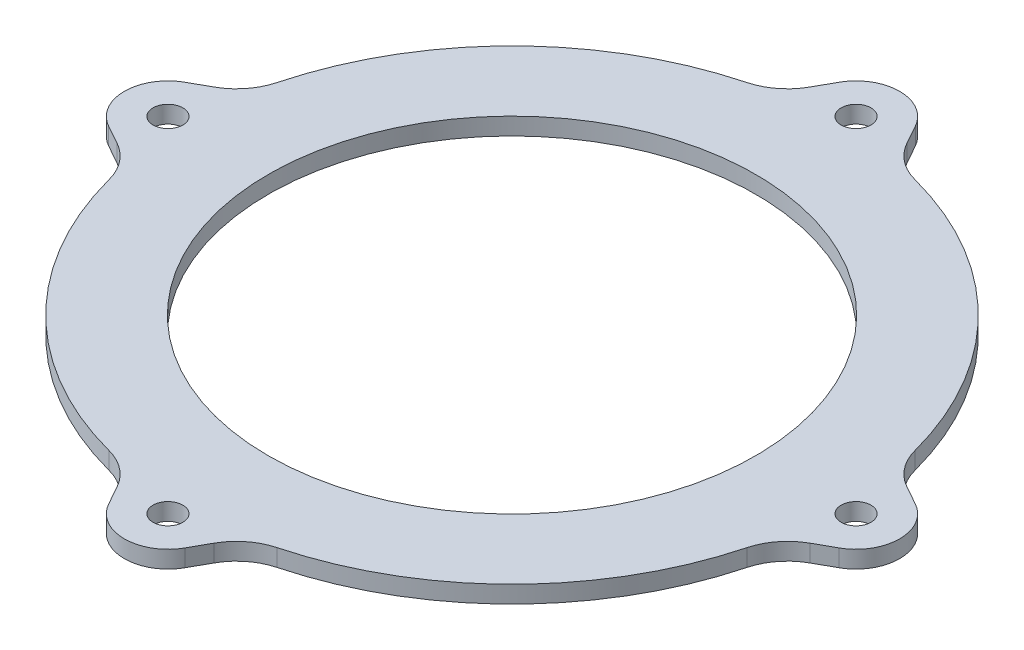
ISO-10303-21;
HEADER;
FILE_DESCRIPTION(('STEP AP214'),'2;1');
FILE_NAME('part.step','',(''),(''),'','','');
FILE_SCHEMA(('AUTOMOTIVE_DESIGN { 1 0 10303 214 1 1 1 1 }'));
ENDSEC;
DATA;
#1=APPLICATION_CONTEXT('core data for automotive mechanical design processes');
#2=APPLICATION_PROTOCOL_DEFINITION('international standard','automotive_design',2000,#1);
#3=PRODUCT_CONTEXT('',#1,'mechanical');
#4=PRODUCT('Part','Part','',(#3));
#5=PRODUCT_RELATED_PRODUCT_CATEGORY('part','',(#4));
#6=PRODUCT_DEFINITION_FORMATION('','',#4);
#7=PRODUCT_DEFINITION_CONTEXT('part definition',#1,'design');
#8=PRODUCT_DEFINITION('design','',#6,#7);
#9=PRODUCT_DEFINITION_SHAPE('','',#8);
#10=(LENGTH_UNIT() NAMED_UNIT(*) SI_UNIT(.MILLI.,.METRE.));
#11=(NAMED_UNIT(*) PLANE_ANGLE_UNIT() SI_UNIT($,.RADIAN.));
#12=(NAMED_UNIT(*) SI_UNIT($,.STERADIAN.) SOLID_ANGLE_UNIT());
#13=UNCERTAINTY_MEASURE_WITH_UNIT(LENGTH_MEASURE(1.E-05),#10,'distance_accuracy_value','');
#14=(GEOMETRIC_REPRESENTATION_CONTEXT(3) GLOBAL_UNCERTAINTY_ASSIGNED_CONTEXT((#13)) GLOBAL_UNIT_ASSIGNED_CONTEXT((#10,
#11,#12)) REPRESENTATION_CONTEXT('',''));
#15=CARTESIAN_POINT('',(0.,0.,0.));
#16=DIRECTION('',(0.,0.,1.));
#17=DIRECTION('',(1.,0.,0.));
#18=AXIS2_PLACEMENT_3D('',#15,#16,#17);
#19=CARTESIAN_POINT('',(0.,3.,-60.));
#20=DIRECTION('',(0.,1.,0.));
#21=DIRECTION('',(0.,0.,1.));
#22=AXIS2_PLACEMENT_3D('',#19,#20,#21);
#23=PLANE('',#22);
#24=CARTESIAN_POINT('',(0.,3.,59.9999999999995));
#25=DIRECTION('',(0.,1.,0.));
#26=DIRECTION('',(0.,0.,1.));
#27=AXIS2_PLACEMENT_3D('',#24,#25,#26);
#28=CIRCLE('',#27,2.6);
#29=CARTESIAN_POINT('',(0.,3.,62.5999999999995));
#30=VERTEX_POINT('',#29);
#31=EDGE_CURVE('E439',#30,#30,#28,.T.);
#32=ORIENTED_EDGE('',*,*,#31,.F.);
#33=EDGE_LOOP('',(#32));
#34=FACE_BOUND('',#33,.T.);
#35=CARTESIAN_POINT('',(0.,3.,-60.));
#36=DIRECTION('',(0.,1.,0.));
#37=DIRECTION('',(0.,0.,1.));
#38=AXIS2_PLACEMENT_3D('',#35,#36,#37);
#39=CIRCLE('',#38,2.6);
#40=CARTESIAN_POINT('',(0.,3.,-57.4));
#41=VERTEX_POINT('',#40);
#42=EDGE_CURVE('E427',#41,#41,#39,.T.);
#43=ORIENTED_EDGE('',*,*,#42,.F.);
#44=EDGE_LOOP('',(#43));
#45=FACE_BOUND('',#44,.T.);
#46=CARTESIAN_POINT('',(0.,3.,-60.));
#47=DIRECTION('',(0.,1.,0.));
#48=DIRECTION('',(0.,0.,1.));
#49=AXIS2_PLACEMENT_3D('',#46,#47,#48);
#50=CIRCLE('',#49,7.6);
#51=CARTESIAN_POINT('',(6.64110523457601,3.,-63.6953648349367));
#52=VERTEX_POINT('',#51);
#53=CARTESIAN_POINT('',(-6.64110523457602,3.,-63.6953648349367));
#54=VERTEX_POINT('',#53);
#55=EDGE_CURVE('E206',#52,#54,#50,.T.);
#56=ORIENTED_EDGE('',*,*,#55,.T.);
#57=DIRECTION('',(-0.486232215123255,0.,0.873829636128423));
#58=VECTOR('',#57,1.);
#59=CARTESIAN_POINT('',(-6.64110523457602,3.,-63.6953648349367));
#60=LINE('',#59,#58);
#61=CARTESIAN_POINT('',(-8.47082751707201,3.,-60.4070891785732));
#62=VERTEX_POINT('',#61);
#63=EDGE_CURVE('E194',#54,#62,#60,.T.);
#64=ORIENTED_EDGE('',*,*,#63,.T.);
#65=CARTESIAN_POINT('',(-17.2091238783562,3.,-65.2694113298057));
#66=DIRECTION('',(0.,1.,0.));
#67=DIRECTION('',(0.,0.,1.));
#68=AXIS2_PLACEMENT_3D('',#65,#66,#67);
#69=CIRCLE('',#68,10.);
#70=CARTESIAN_POINT('',(-14.6596240445257,3.,-55.5998689105752));
#71=VERTEX_POINT('',#70);
#72=EDGE_CURVE('E279',#62,#71,#69,.F.);
#73=ORIENTED_EDGE('',*,*,#72,.T.);
#74=CARTESIAN_POINT('',(0.,3.,0.));
#75=DIRECTION('',(0.,1.,0.));
#76=DIRECTION('',(0.,0.,1.));
#77=AXIS2_PLACEMENT_3D('',#74,#75,#76);
#78=CIRCLE('',#77,57.4999999999999);
#79=CARTESIAN_POINT('',(-55.5998689105752,3.,-14.6596240445258));
#80=VERTEX_POINT('',#79);
#81=EDGE_CURVE('E205',#71,#80,#78,.T.);
#82=ORIENTED_EDGE('',*,*,#81,.T.);
#83=CARTESIAN_POINT('',(-65.2694113298056,3.,-17.2091238783564));
#84=DIRECTION('',(0.,1.,0.));
#85=DIRECTION('',(0.,0.,1.));
#86=AXIS2_PLACEMENT_3D('',#83,#84,#85);
#87=CIRCLE('',#86,10.);
#88=CARTESIAN_POINT('',(-60.4070891785731,3.,-8.47082751707215));
#89=VERTEX_POINT('',#88);
#90=EDGE_CURVE('E283',#80,#89,#87,.F.);
#91=ORIENTED_EDGE('',*,*,#90,.T.);
#92=DIRECTION('',(-0.873829636128424,0.,0.486232215123254));
#93=VECTOR('',#92,1.);
#94=CARTESIAN_POINT('',(-63.6953648349364,3.,-6.64110523457632));
#95=LINE('',#94,#93);
#96=CARTESIAN_POINT('',(-63.6953648349363,3.,-6.6411052345761));
#97=VERTEX_POINT('',#96);
#98=EDGE_CURVE('E377',#89,#97,#95,.T.);
#99=ORIENTED_EDGE('',*,*,#98,.T.);
#100=CARTESIAN_POINT('',(-59.9999999999997,3.,0.));
#101=DIRECTION('',(0.,1.,0.));
#102=DIRECTION('',(0.,0.,1.));
#103=AXIS2_PLACEMENT_3D('',#100,#101,#102);
#104=CIRCLE('',#103,7.59999999999999);
#105=CARTESIAN_POINT('',(-63.6953648349364,3.,6.6411052345757));
#106=VERTEX_POINT('',#105);
#107=EDGE_CURVE('E374',#97,#106,#104,.T.);
#108=ORIENTED_EDGE('',*,*,#107,.T.);
#109=DIRECTION('',(0.873829636128421,0.,0.486232215123259));
#110=VECTOR('',#109,1.);
#111=CARTESIAN_POINT('',(-63.6953648349364,3.,6.6411052345757));
#112=LINE('',#111,#110);
#113=CARTESIAN_POINT('',(-60.407089178573,3.,8.47082751707166));
#114=VERTEX_POINT('',#113);
#115=EDGE_CURVE('E366',#106,#114,#112,.T.);
#116=ORIENTED_EDGE('',*,*,#115,.T.);
#117=CARTESIAN_POINT('',(-65.2694113298056,3.,17.2091238783559));
#118=DIRECTION('',(0.,1.,0.));
#119=DIRECTION('',(0.,0.,1.));
#120=AXIS2_PLACEMENT_3D('',#117,#118,#119);
#121=CIRCLE('',#120,10.);
#122=CARTESIAN_POINT('',(-55.5998689105751,3.,14.6596240445254));
#123=VERTEX_POINT('',#122);
#124=EDGE_CURVE('E287',#114,#123,#121,.F.);
#125=ORIENTED_EDGE('',*,*,#124,.T.);
#126=CARTESIAN_POINT('',(0.,3.,0.));
#127=DIRECTION('',(0.,1.,0.));
#128=DIRECTION('',(0.,0.,1.));
#129=AXIS2_PLACEMENT_3D('',#126,#127,#128);
#130=CIRCLE('',#129,57.4999999999996);
#131=CARTESIAN_POINT('',(-14.6596240445255,3.,55.599868910575));
#132=VERTEX_POINT('',#131);
#133=EDGE_CURVE('E298',#123,#132,#130,.T.);
#134=ORIENTED_EDGE('',*,*,#133,.T.);
#135=CARTESIAN_POINT('',(-17.209123878356,3.,65.2694113298055));
#136=DIRECTION('',(0.,1.,0.));
#137=DIRECTION('',(0.,0.,1.));
#138=AXIS2_PLACEMENT_3D('',#135,#136,#137);
#139=CIRCLE('',#138,10.);
#140=CARTESIAN_POINT('',(-8.47082751707182,3.,60.407089178573));
#141=VERTEX_POINT('',#140);
#142=EDGE_CURVE('E291',#132,#141,#139,.F.);
#143=ORIENTED_EDGE('',*,*,#142,.T.);
#144=DIRECTION('',(0.486232215123255,0.,0.873829636128423));
#145=VECTOR('',#144,1.);
#146=CARTESIAN_POINT('',(-6.64110523457596,3.,63.6953648349363));
#147=LINE('',#146,#145);
#148=CARTESIAN_POINT('',(-6.64110523457601,3.,63.6953648349363));
#149=VERTEX_POINT('',#148);
#150=EDGE_CURVE('E295',#141,#149,#147,.T.);
#151=ORIENTED_EDGE('',*,*,#150,.T.);
#152=CARTESIAN_POINT('',(0.,3.,59.9999999999995));
#153=DIRECTION('',(0.,1.,0.));
#154=DIRECTION('',(0.,0.,1.));
#155=AXIS2_PLACEMENT_3D('',#152,#153,#154);
#156=CIRCLE('',#155,7.60000000000002);
#157=CARTESIAN_POINT('',(6.64110523457607,3.,63.6953648349363));
#158=VERTEX_POINT('',#157);
#159=EDGE_CURVE('E308',#149,#158,#156,.T.);
#160=ORIENTED_EDGE('',*,*,#159,.T.);
#161=DIRECTION('',(0.486232215123259,0.,-0.873829636128421));
#162=VECTOR('',#161,1.);
#163=CARTESIAN_POINT('',(6.64110523457607,3.,63.6953648349363));
#164=LINE('',#163,#162);
#165=CARTESIAN_POINT('',(8.47082751707193,3.,60.407089178573));
#166=VERTEX_POINT('',#165);
#167=EDGE_CURVE('E382',#158,#166,#164,.T.);
#168=ORIENTED_EDGE('',*,*,#167,.T.);
#169=CARTESIAN_POINT('',(17.2091238783561,3.,65.2694113298056));
#170=DIRECTION('',(0.,1.,0.));
#171=DIRECTION('',(0.,0.,1.));
#172=AXIS2_PLACEMENT_3D('',#169,#170,#171);
#173=CIRCLE('',#172,10.);
#174=CARTESIAN_POINT('',(14.6596240445256,3.,55.5998689105751));
#175=VERTEX_POINT('',#174);
#176=EDGE_CURVE('E11',#166,#175,#173,.F.);
#177=ORIENTED_EDGE('',*,*,#176,.T.);
#178=CARTESIAN_POINT('',(0.,3.,0.));
#179=DIRECTION('',(0.,1.,0.));
#180=DIRECTION('',(0.,0.,1.));
#181=AXIS2_PLACEMENT_3D('',#178,#179,#180);
#182=CIRCLE('',#181,57.4999999999997);
#183=CARTESIAN_POINT('',(55.5998689105752,3.,14.6596240445254));
#184=VERTEX_POINT('',#183);
#185=EDGE_CURVE('E384',#175,#184,#182,.T.);
#186=ORIENTED_EDGE('',*,*,#185,.T.);
#187=CARTESIAN_POINT('',(65.2694113298056,3.,17.209123878356));
#188=DIRECTION('',(0.,1.,0.));
#189=DIRECTION('',(0.,0.,1.));
#190=AXIS2_PLACEMENT_3D('',#187,#188,#189);
#191=CIRCLE('',#190,10.);
#192=CARTESIAN_POINT('',(60.4070891785731,3.,8.47082751707175));
#193=VERTEX_POINT('',#192);
#194=EDGE_CURVE('E267',#184,#193,#191,.F.);
#195=ORIENTED_EDGE('',*,*,#194,.T.);
#196=DIRECTION('',(0.873829636128423,0.,-0.486232215123256));
#197=VECTOR('',#196,1.);
#198=CARTESIAN_POINT('',(63.6953648349366,3.,6.64110523457578));
#199=LINE('',#198,#197);
#200=CARTESIAN_POINT('',(63.6953648349365,3.,6.64110523457553));
#201=VERTEX_POINT('',#200);
#202=EDGE_CURVE('E387',#193,#201,#199,.T.);
#203=ORIENTED_EDGE('',*,*,#202,.T.);
#204=CARTESIAN_POINT('',(59.9999999999999,3.,-5.62050406216485E-13));
#205=DIRECTION('',(0.,1.,0.));
#206=DIRECTION('',(0.,0.,1.));
#207=AXIS2_PLACEMENT_3D('',#204,#205,#206);
#208=CIRCLE('',#207,7.59999999999999);
#209=CARTESIAN_POINT('',(63.6953648349367,3.,-6.64110523457625));
#210=VERTEX_POINT('',#209);
#211=EDGE_CURVE('E389',#201,#210,#208,.T.);
#212=ORIENTED_EDGE('',*,*,#211,.T.);
#213=DIRECTION('',(-0.873829636128422,0.,-0.486232215123257));
#214=VECTOR('',#213,1.);
#215=CARTESIAN_POINT('',(63.6953648349367,3.,-6.64110523457625));
#216=LINE('',#215,#214);
#217=CARTESIAN_POINT('',(60.4070891785732,3.,-8.47082751707217));
#218=VERTEX_POINT('',#217);
#219=EDGE_CURVE('E391',#210,#218,#216,.T.);
#220=ORIENTED_EDGE('',*,*,#219,.T.);
#221=CARTESIAN_POINT('',(65.2694113298058,3.,-17.2091238783564));
#222=DIRECTION('',(0.,1.,0.));
#223=DIRECTION('',(0.,0.,1.));
#224=AXIS2_PLACEMENT_3D('',#221,#222,#223);
#225=CIRCLE('',#224,10.);
#226=CARTESIAN_POINT('',(55.5998689105753,3.,-14.6596240445258));
#227=VERTEX_POINT('',#226);
#228=EDGE_CURVE('E271',#218,#227,#225,.F.);
#229=ORIENTED_EDGE('',*,*,#228,.T.);
#230=CARTESIAN_POINT('',(0.,3.,0.));
#231=DIRECTION('',(0.,1.,0.));
#232=DIRECTION('',(0.,0.,1.));
#233=AXIS2_PLACEMENT_3D('',#230,#231,#232);
#234=CIRCLE('',#233,57.5);
#235=CARTESIAN_POINT('',(14.6596240445256,3.,-55.5998689105754));
#236=VERTEX_POINT('',#235);
#237=EDGE_CURVE('E394',#227,#236,#234,.T.);
#238=ORIENTED_EDGE('',*,*,#237,.T.);
#239=CARTESIAN_POINT('',(17.2091238783562,3.,-65.2694113298058));
#240=DIRECTION('',(0.,1.,0.));
#241=DIRECTION('',(0.,0.,1.));
#242=AXIS2_PLACEMENT_3D('',#239,#240,#241);
#243=CIRCLE('',#242,10.);
#244=CARTESIAN_POINT('',(8.47082751707194,3.,-60.4070891785733));
#245=VERTEX_POINT('',#244);
#246=EDGE_CURVE('E275',#236,#245,#243,.F.);
#247=ORIENTED_EDGE('',*,*,#246,.T.);
#248=DIRECTION('',(-0.486232215123257,0.,-0.873829636128422));
#249=VECTOR('',#248,1.);
#250=CARTESIAN_POINT('',(6.64110523457601,3.,-63.6953648349367));
#251=LINE('',#250,#249);
#252=EDGE_CURVE('E211',#245,#52,#251,.T.);
#253=ORIENTED_EDGE('',*,*,#252,.T.);
#254=EDGE_LOOP('',(#56,#64,#73,#82,#91,#99,#108,#116,#125,#134,#143,#151,#160,#168,#177,#186,
#195,#203,#212,#220,#229,#238,#247,#253));
#255=FACE_BOUND('',#254,.T.);
#256=CARTESIAN_POINT('',(0.,3.,0.));
#257=DIRECTION('',(0.,1.,0.));
#258=DIRECTION('',(0.,0.,1.));
#259=AXIS2_PLACEMENT_3D('',#256,#257,#258);
#260=CIRCLE('',#259,42.5);
#261=CARTESIAN_POINT('',(0.,3.,42.5));
#262=VERTEX_POINT('',#261);
#263=EDGE_CURVE('E400',#262,#262,#260,.T.);
#264=ORIENTED_EDGE('',*,*,#263,.F.);
#265=EDGE_LOOP('',(#264));
#266=FACE_BOUND('',#265,.T.);
#267=CARTESIAN_POINT('',(59.9999999999999,3.,-5.62050406216485E-13));
#268=DIRECTION('',(0.,1.,0.));
#269=DIRECTION('',(0.,0.,1.));
#270=AXIS2_PLACEMENT_3D('',#267,#268,#269);
#271=CIRCLE('',#270,2.6);
#272=CARTESIAN_POINT('',(59.9999999999999,3.,2.59999999999944));
#273=VERTEX_POINT('',#272);
#274=EDGE_CURVE('E433',#273,#273,#271,.T.);
#275=ORIENTED_EDGE('',*,*,#274,.F.);
#276=EDGE_LOOP('',(#275));
#277=FACE_BOUND('',#276,.T.);
#278=CARTESIAN_POINT('',(-59.9999999999997,3.,0.));
#279=DIRECTION('',(0.,1.,0.));
#280=DIRECTION('',(0.,0.,1.));
#281=AXIS2_PLACEMENT_3D('',#278,#279,#280);
#282=CIRCLE('',#281,2.6);
#283=CARTESIAN_POINT('',(-59.9999999999997,3.,2.6));
#284=VERTEX_POINT('',#283);
#285=EDGE_CURVE('E445',#284,#284,#282,.T.);
#286=ORIENTED_EDGE('',*,*,#285,.F.);
#287=EDGE_LOOP('',(#286));
#288=FACE_BOUND('',#287,.T.);
#289=ADVANCED_FACE('F33',(#34,#45,#255,#266,#277,#288),#23,.T.);
#290=CARTESIAN_POINT('',(0.,0.,-60.));
#291=DIRECTION('',(0.,1.,0.));
#292=DIRECTION('',(0.,0.,1.));
#293=AXIS2_PLACEMENT_3D('',#290,#291,#292);
#294=PLANE('',#293);
#295=CARTESIAN_POINT('',(0.,0.,-60.));
#296=DIRECTION('',(0.,1.,0.));
#297=DIRECTION('',(0.,0.,1.));
#298=AXIS2_PLACEMENT_3D('',#295,#296,#297);
#299=CIRCLE('',#298,7.6);
#300=CARTESIAN_POINT('',(6.64110523457601,0.,-63.6953648349367));
#301=VERTEX_POINT('',#300);
#302=CARTESIAN_POINT('',(-6.64110523457602,0.,-63.6953648349367));
#303=VERTEX_POINT('',#302);
#304=EDGE_CURVE('E219',#301,#303,#299,.T.);
#305=ORIENTED_EDGE('',*,*,#304,.F.);
#306=DIRECTION('',(-0.486232215123257,0.,-0.873829636128422));
#307=VECTOR('',#306,1.);
#308=CARTESIAN_POINT('',(6.64110523457601,0.,-63.6953648349367));
#309=LINE('',#308,#307);
#310=CARTESIAN_POINT('',(8.47082751707194,0.,-60.4070891785733));
#311=VERTEX_POINT('',#310);
#312=EDGE_CURVE('E215',#311,#301,#309,.T.);
#313=ORIENTED_EDGE('',*,*,#312,.F.);
#314=CARTESIAN_POINT('',(17.2091238783562,0.,-65.2694113298058));
#315=DIRECTION('',(0.,1.,0.));
#316=DIRECTION('',(0.,0.,1.));
#317=AXIS2_PLACEMENT_3D('',#314,#315,#316);
#318=CIRCLE('',#317,10.);
#319=CARTESIAN_POINT('',(14.6596240445256,0.,-55.5998689105754));
#320=VERTEX_POINT('',#319);
#321=EDGE_CURVE('E273',#311,#320,#318,.T.);
#322=ORIENTED_EDGE('',*,*,#321,.T.);
#323=CARTESIAN_POINT('',(0.,0.,0.));
#324=DIRECTION('',(0.,1.,0.));
#325=DIRECTION('',(0.,0.,1.));
#326=AXIS2_PLACEMENT_3D('',#323,#324,#325);
#327=CIRCLE('',#326,57.5);
#328=CARTESIAN_POINT('',(55.5998689105753,0.,-14.6596240445258));
#329=VERTEX_POINT('',#328);
#330=EDGE_CURVE('E343',#329,#320,#327,.T.);
#331=ORIENTED_EDGE('',*,*,#330,.F.);
#332=CARTESIAN_POINT('',(65.2694113298058,0.,-17.2091238783564));
#333=DIRECTION('',(0.,1.,0.));
#334=DIRECTION('',(0.,0.,1.));
#335=AXIS2_PLACEMENT_3D('',#332,#333,#334);
#336=CIRCLE('',#335,10.);
#337=CARTESIAN_POINT('',(60.4070891785732,0.,-8.47082751707217));
#338=VERTEX_POINT('',#337);
#339=EDGE_CURVE('E269',#329,#338,#336,.T.);
#340=ORIENTED_EDGE('',*,*,#339,.T.);
#341=DIRECTION('',(-0.873829636128422,0.,-0.486232215123257));
#342=VECTOR('',#341,1.);
#343=CARTESIAN_POINT('',(63.6953648349367,0.,-6.64110523457625));
#344=LINE('',#343,#342);
#345=CARTESIAN_POINT('',(63.6953648349367,0.,-6.64110523457625));
#346=VERTEX_POINT('',#345);
#347=EDGE_CURVE('E340',#346,#338,#344,.T.);
#348=ORIENTED_EDGE('',*,*,#347,.F.);
#349=CARTESIAN_POINT('',(59.9999999999999,0.,-5.62050406216485E-13));
#350=DIRECTION('',(0.,1.,0.));
#351=DIRECTION('',(0.,0.,1.));
#352=AXIS2_PLACEMENT_3D('',#349,#350,#351);
#353=CIRCLE('',#352,7.59999999999999);
#354=CARTESIAN_POINT('',(63.6953648349365,0.,6.64110523457553));
#355=VERTEX_POINT('',#354);
#356=EDGE_CURVE('E338',#355,#346,#353,.T.);
#357=ORIENTED_EDGE('',*,*,#356,.F.);
#358=DIRECTION('',(0.873829636128423,0.,-0.486232215123256));
#359=VECTOR('',#358,1.);
#360=CARTESIAN_POINT('',(63.6953648349366,0.,6.64110523457578));
#361=LINE('',#360,#359);
#362=CARTESIAN_POINT('',(60.4070891785731,0.,8.47082751707175));
#363=VERTEX_POINT('',#362);
#364=EDGE_CURVE('E336',#363,#355,#361,.T.);
#365=ORIENTED_EDGE('',*,*,#364,.F.);
#366=CARTESIAN_POINT('',(65.2694113298056,0.,17.209123878356));
#367=DIRECTION('',(0.,1.,0.));
#368=DIRECTION('',(0.,0.,1.));
#369=AXIS2_PLACEMENT_3D('',#366,#367,#368);
#370=CIRCLE('',#369,10.);
#371=CARTESIAN_POINT('',(55.5998689105752,0.,14.6596240445254));
#372=VERTEX_POINT('',#371);
#373=EDGE_CURVE('E265',#363,#372,#370,.T.);
#374=ORIENTED_EDGE('',*,*,#373,.T.);
#375=CARTESIAN_POINT('',(0.,0.,0.));
#376=DIRECTION('',(0.,1.,0.));
#377=DIRECTION('',(0.,0.,1.));
#378=AXIS2_PLACEMENT_3D('',#375,#376,#377);
#379=CIRCLE('',#378,57.4999999999997);
#380=CARTESIAN_POINT('',(14.6596240445256,0.,55.5998689105751));
#381=VERTEX_POINT('',#380);
#382=EDGE_CURVE('E333',#381,#372,#379,.T.);
#383=ORIENTED_EDGE('',*,*,#382,.F.);
#384=CARTESIAN_POINT('',(17.2091238783561,0.,65.2694113298056));
#385=DIRECTION('',(0.,1.,0.));
#386=DIRECTION('',(0.,0.,1.));
#387=AXIS2_PLACEMENT_3D('',#384,#385,#386);
#388=CIRCLE('',#387,10.);
#389=CARTESIAN_POINT('',(8.47082751707193,0.,60.407089178573));
#390=VERTEX_POINT('',#389);
#391=EDGE_CURVE('E41',#381,#390,#388,.T.);
#392=ORIENTED_EDGE('',*,*,#391,.T.);
#393=DIRECTION('',(0.486232215123259,0.,-0.873829636128421));
#394=VECTOR('',#393,1.);
#395=CARTESIAN_POINT('',(6.64110523457607,0.,63.6953648349363));
#396=LINE('',#395,#394);
#397=CARTESIAN_POINT('',(6.64110523457607,0.,63.6953648349363));
#398=VERTEX_POINT('',#397);
#399=EDGE_CURVE('E331',#398,#390,#396,.T.);
#400=ORIENTED_EDGE('',*,*,#399,.F.);
#401=CARTESIAN_POINT('',(0.,0.,59.9999999999995));
#402=DIRECTION('',(0.,1.,0.));
#403=DIRECTION('',(0.,0.,1.));
#404=AXIS2_PLACEMENT_3D('',#401,#402,#403);
#405=CIRCLE('',#404,7.60000000000002);
#406=CARTESIAN_POINT('',(-6.64110523457601,0.,63.6953648349363));
#407=VERTEX_POINT('',#406);
#408=EDGE_CURVE('E323',#407,#398,#405,.T.);
#409=ORIENTED_EDGE('',*,*,#408,.F.);
#410=DIRECTION('',(0.486232215123255,0.,0.873829636128423));
#411=VECTOR('',#410,1.);
#412=CARTESIAN_POINT('',(-6.64110523457596,0.,63.6953648349363));
#413=LINE('',#412,#411);
#414=CARTESIAN_POINT('',(-8.47082751707182,0.,60.407089178573));
#415=VERTEX_POINT('',#414);
#416=EDGE_CURVE('E317',#415,#407,#413,.T.);
#417=ORIENTED_EDGE('',*,*,#416,.F.);
#418=CARTESIAN_POINT('',(-17.209123878356,0.,65.2694113298055));
#419=DIRECTION('',(0.,1.,0.));
#420=DIRECTION('',(0.,0.,1.));
#421=AXIS2_PLACEMENT_3D('',#418,#419,#420);
#422=CIRCLE('',#421,10.);
#423=CARTESIAN_POINT('',(-14.6596240445255,0.,55.599868910575));
#424=VERTEX_POINT('',#423);
#425=EDGE_CURVE('E289',#415,#424,#422,.T.);
#426=ORIENTED_EDGE('',*,*,#425,.T.);
#427=CARTESIAN_POINT('',(0.,0.,0.));
#428=DIRECTION('',(0.,1.,0.));
#429=DIRECTION('',(0.,0.,1.));
#430=AXIS2_PLACEMENT_3D('',#427,#428,#429);
#431=CIRCLE('',#430,57.4999999999996);
#432=CARTESIAN_POINT('',(-55.5998689105751,0.,14.6596240445254));
#433=VERTEX_POINT('',#432);
#434=EDGE_CURVE('E315',#433,#424,#431,.T.);
#435=ORIENTED_EDGE('',*,*,#434,.F.);
#436=CARTESIAN_POINT('',(-65.2694113298056,0.,17.2091238783559));
#437=DIRECTION('',(0.,1.,0.));
#438=DIRECTION('',(0.,0.,1.));
#439=AXIS2_PLACEMENT_3D('',#436,#437,#438);
#440=CIRCLE('',#439,10.);
#441=CARTESIAN_POINT('',(-60.407089178573,0.,8.47082751707166));
#442=VERTEX_POINT('',#441);
#443=EDGE_CURVE('E285',#433,#442,#440,.T.);
#444=ORIENTED_EDGE('',*,*,#443,.T.);
#445=DIRECTION('',(0.873829636128421,0.,0.486232215123259));
#446=VECTOR('',#445,1.);
#447=CARTESIAN_POINT('',(-63.6953648349364,0.,6.6411052345757));
#448=LINE('',#447,#446);
#449=CARTESIAN_POINT('',(-63.6953648349364,0.,6.6411052345757));
#450=VERTEX_POINT('',#449);
#451=EDGE_CURVE('E321',#450,#442,#448,.T.);
#452=ORIENTED_EDGE('',*,*,#451,.F.);
#453=CARTESIAN_POINT('',(-59.9999999999997,0.,0.));
#454=DIRECTION('',(0.,1.,0.));
#455=DIRECTION('',(0.,0.,1.));
#456=AXIS2_PLACEMENT_3D('',#453,#454,#455);
#457=CIRCLE('',#456,7.59999999999999);
#458=CARTESIAN_POINT('',(-63.6953648349363,0.,-6.6411052345761));
#459=VERTEX_POINT('',#458);
#460=EDGE_CURVE('E326',#459,#450,#457,.T.);
#461=ORIENTED_EDGE('',*,*,#460,.F.);
#462=DIRECTION('',(-0.873829636128424,0.,0.486232215123254));
#463=VECTOR('',#462,1.);
#464=CARTESIAN_POINT('',(-63.6953648349364,0.,-6.64110523457632));
#465=LINE('',#464,#463);
#466=CARTESIAN_POINT('',(-60.4070891785731,0.,-8.47082751707215));
#467=VERTEX_POINT('',#466);
#468=EDGE_CURVE('E405',#467,#459,#465,.T.);
#469=ORIENTED_EDGE('',*,*,#468,.F.);
#470=CARTESIAN_POINT('',(-65.2694113298056,0.,-17.2091238783564));
#471=DIRECTION('',(0.,1.,0.));
#472=DIRECTION('',(0.,0.,1.));
#473=AXIS2_PLACEMENT_3D('',#470,#471,#472);
#474=CIRCLE('',#473,10.);
#475=CARTESIAN_POINT('',(-55.5998689105752,0.,-14.6596240445258));
#476=VERTEX_POINT('',#475);
#477=EDGE_CURVE('E281',#467,#476,#474,.T.);
#478=ORIENTED_EDGE('',*,*,#477,.T.);
#479=CARTESIAN_POINT('',(0.,0.,0.));
#480=DIRECTION('',(0.,1.,0.));
#481=DIRECTION('',(0.,0.,1.));
#482=AXIS2_PLACEMENT_3D('',#479,#480,#481);
#483=CIRCLE('',#482,57.4999999999999);
#484=CARTESIAN_POINT('',(-14.6596240445257,0.,-55.5998689105752));
#485=VERTEX_POINT('',#484);
#486=EDGE_CURVE('E402',#485,#476,#483,.T.);
#487=ORIENTED_EDGE('',*,*,#486,.F.);
#488=CARTESIAN_POINT('',(-17.2091238783562,0.,-65.2694113298057));
#489=DIRECTION('',(0.,1.,0.));
#490=DIRECTION('',(0.,0.,1.));
#491=AXIS2_PLACEMENT_3D('',#488,#489,#490);
#492=CIRCLE('',#491,10.);
#493=CARTESIAN_POINT('',(-8.47082751707201,0.,-60.4070891785732));
#494=VERTEX_POINT('',#493);
#495=EDGE_CURVE('E277',#485,#494,#492,.T.);
#496=ORIENTED_EDGE('',*,*,#495,.T.);
#497=DIRECTION('',(-0.486232215123255,0.,0.873829636128423));
#498=VECTOR('',#497,1.);
#499=CARTESIAN_POINT('',(-6.64110523457602,0.,-63.6953648349367));
#500=LINE('',#499,#498);
#501=EDGE_CURVE('E399',#303,#494,#500,.T.);
#502=ORIENTED_EDGE('',*,*,#501,.F.);
#503=EDGE_LOOP('',(#305,#313,#322,#331,#340,#348,#357,#365,#374,#383,#392,#400,#409,#417,#426,
#435,#444,#452,#461,#469,#478,#487,#496,#502));
#504=FACE_BOUND('',#503,.T.);
#505=CARTESIAN_POINT('',(0.,0.,0.));
#506=DIRECTION('',(0.,1.,0.));
#507=DIRECTION('',(0.,0.,1.));
#508=AXIS2_PLACEMENT_3D('',#505,#506,#507);
#509=CIRCLE('',#508,42.5);
#510=CARTESIAN_POINT('',(0.,0.,42.5));
#511=VERTEX_POINT('',#510);
#512=EDGE_CURVE('E424',#511,#511,#509,.T.);
#513=ORIENTED_EDGE('',*,*,#512,.T.);
#514=EDGE_LOOP('',(#513));
#515=FACE_BOUND('',#514,.T.);
#516=CARTESIAN_POINT('',(0.,0.,-60.));
#517=DIRECTION('',(0.,1.,0.));
#518=DIRECTION('',(0.,0.,1.));
#519=AXIS2_PLACEMENT_3D('',#516,#517,#518);
#520=CIRCLE('',#519,2.6);
#521=CARTESIAN_POINT('',(0.,0.,-57.4));
#522=VERTEX_POINT('',#521);
#523=EDGE_CURVE('E430',#522,#522,#520,.T.);
#524=ORIENTED_EDGE('',*,*,#523,.T.);
#525=EDGE_LOOP('',(#524));
#526=FACE_BOUND('',#525,.T.);
#527=CARTESIAN_POINT('',(59.9999999999999,0.,-5.62050406216485E-13));
#528=DIRECTION('',(0.,1.,0.));
#529=DIRECTION('',(0.,0.,1.));
#530=AXIS2_PLACEMENT_3D('',#527,#528,#529);
#531=CIRCLE('',#530,2.6);
#532=CARTESIAN_POINT('',(59.9999999999999,0.,2.59999999999944));
#533=VERTEX_POINT('',#532);
#534=EDGE_CURVE('E436',#533,#533,#531,.T.);
#535=ORIENTED_EDGE('',*,*,#534,.T.);
#536=EDGE_LOOP('',(#535));
#537=FACE_BOUND('',#536,.T.);
#538=CARTESIAN_POINT('',(0.,0.,59.9999999999995));
#539=DIRECTION('',(0.,1.,0.));
#540=DIRECTION('',(0.,0.,1.));
#541=AXIS2_PLACEMENT_3D('',#538,#539,#540);
#542=CIRCLE('',#541,2.6);
#543=CARTESIAN_POINT('',(0.,0.,62.5999999999995));
#544=VERTEX_POINT('',#543);
#545=EDGE_CURVE('E442',#544,#544,#542,.T.);
#546=ORIENTED_EDGE('',*,*,#545,.T.);
#547=EDGE_LOOP('',(#546));
#548=FACE_BOUND('',#547,.T.);
#549=CARTESIAN_POINT('',(-59.9999999999997,0.,0.));
#550=DIRECTION('',(0.,1.,0.));
#551=DIRECTION('',(0.,0.,1.));
#552=AXIS2_PLACEMENT_3D('',#549,#550,#551);
#553=CIRCLE('',#552,2.6);
#554=CARTESIAN_POINT('',(-59.9999999999997,0.,2.6));
#555=VERTEX_POINT('',#554);
#556=EDGE_CURVE('E448',#555,#555,#553,.T.);
#557=ORIENTED_EDGE('',*,*,#556,.T.);
#558=EDGE_LOOP('',(#557));
#559=FACE_BOUND('',#558,.T.);
#560=ADVANCED_FACE('F313',(#504,#515,#526,#537,#548,#559),#294,.F.);
#561=CARTESIAN_POINT('',(0.,3.,-60.));
#562=DIRECTION('',(0.,-1.,0.));
#563=DIRECTION('',(0.,0.,-1.));
#564=AXIS2_PLACEMENT_3D('',#561,#562,#563);
#565=CYLINDRICAL_SURFACE('',#564,7.6);
#566=ORIENTED_EDGE('',*,*,#304,.T.);
#567=DIRECTION('',(0.,-1.,0.));
#568=VECTOR('',#567,1.);
#569=CARTESIAN_POINT('',(-6.64110523457602,3.,-63.6953648349367));
#570=LINE('',#569,#568);
#571=EDGE_CURVE('E199',#54,#303,#570,.T.);
#572=ORIENTED_EDGE('',*,*,#571,.F.);
#573=ORIENTED_EDGE('',*,*,#55,.F.);
#574=DIRECTION('',(0.,-1.,0.));
#575=VECTOR('',#574,1.);
#576=CARTESIAN_POINT('',(6.64110523457601,3.,-63.6953648349367));
#577=LINE('',#576,#575);
#578=EDGE_CURVE('E347',#52,#301,#577,.T.);
#579=ORIENTED_EDGE('',*,*,#578,.T.);
#580=EDGE_LOOP('',(#566,#572,#573,#579));
#581=FACE_BOUND('',#580,.T.);
#582=ADVANCED_FACE('F217',(#581),#565,.T.);
#583=CARTESIAN_POINT('',(-6.64110523457602,3.,-63.6953648349367));
#584=DIRECTION('',(0.873829636128423,0.,0.486232215123255));
#585=DIRECTION('',(0.486232215123255,0.,-0.873829636128423));
#586=AXIS2_PLACEMENT_3D('',#583,#584,#585);
#587=PLANE('',#586);
#588=ORIENTED_EDGE('',*,*,#501,.T.);
#589=DIRECTION('',(0.,1.,0.));
#590=VECTOR('',#589,1.);
#591=CARTESIAN_POINT('',(-8.47082751707201,3.,-60.4070891785732));
#592=LINE('',#591,#590);
#593=EDGE_CURVE('E202',#494,#62,#592,.T.);
#594=ORIENTED_EDGE('',*,*,#593,.T.);
#595=ORIENTED_EDGE('',*,*,#63,.F.);
#596=ORIENTED_EDGE('',*,*,#571,.T.);
#597=EDGE_LOOP('',(#588,#594,#595,#596));
#598=FACE_BOUND('',#597,.T.);
#599=ADVANCED_FACE('F197',(#598),#587,.F.);
#600=CARTESIAN_POINT('',(0.,3.,0.));
#601=DIRECTION('',(0.,-1.,0.));
#602=DIRECTION('',(0.,0.,-1.));
#603=AXIS2_PLACEMENT_3D('',#600,#601,#602);
#604=CYLINDRICAL_SURFACE('',#603,57.4999999999999);
#605=ORIENTED_EDGE('',*,*,#81,.F.);
#606=DIRECTION('',(0.,-1.,0.));
#607=VECTOR('',#606,1.);
#608=CARTESIAN_POINT('',(-14.6596240445257,3.,-55.5998689105752));
#609=LINE('',#608,#607);
#610=EDGE_CURVE('E247',#71,#485,#609,.T.);
#611=ORIENTED_EDGE('',*,*,#610,.T.);
#612=ORIENTED_EDGE('',*,*,#486,.T.);
#613=DIRECTION('',(0.,-1.,0.));
#614=VECTOR('',#613,1.);
#615=CARTESIAN_POINT('',(-55.5998689105752,3.,-14.6596240445258));
#616=LINE('',#615,#614);
#617=EDGE_CURVE('E245',#476,#80,#616,.F.);
#618=ORIENTED_EDGE('',*,*,#617,.T.);
#619=EDGE_LOOP('',(#605,#611,#612,#618));
#620=FACE_BOUND('',#619,.T.);
#621=ADVANCED_FACE('F417',(#620),#604,.T.);
#622=CARTESIAN_POINT('',(-63.6953648349364,3.,-6.64110523457632));
#623=DIRECTION('',(0.486232215123254,0.,0.873829636128424));
#624=DIRECTION('',(0.873829636128424,0.,-0.486232215123254));
#625=AXIS2_PLACEMENT_3D('',#622,#623,#624);
#626=PLANE('',#625);
#627=ORIENTED_EDGE('',*,*,#98,.F.);
#628=DIRECTION('',(0.,1.,0.));
#629=VECTOR('',#628,1.);
#630=CARTESIAN_POINT('',(-60.4070891785731,0.,-8.47082751707215));
#631=LINE('',#630,#629);
#632=EDGE_CURVE('E251',#89,#467,#631,.F.);
#633=ORIENTED_EDGE('',*,*,#632,.T.);
#634=ORIENTED_EDGE('',*,*,#468,.T.);
#635=DIRECTION('',(0.,-1.,0.));
#636=VECTOR('',#635,1.);
#637=CARTESIAN_POINT('',(-63.6953648349363,3.,-6.6411052345761));
#638=LINE('',#637,#636);
#639=EDGE_CURVE('E221',#97,#459,#638,.T.);
#640=ORIENTED_EDGE('',*,*,#639,.F.);
#641=EDGE_LOOP('',(#627,#633,#634,#640));
#642=FACE_BOUND('',#641,.T.);
#643=ADVANCED_FACE('F410',(#642),#626,.F.);
#644=CARTESIAN_POINT('',(-59.9999999999997,3.,0.));
#645=DIRECTION('',(0.,-1.,0.));
#646=DIRECTION('',(0.,0.,-1.));
#647=AXIS2_PLACEMENT_3D('',#644,#645,#646);
#648=CYLINDRICAL_SURFACE('',#647,7.59999999999999);
#649=ORIENTED_EDGE('',*,*,#460,.T.);
#650=DIRECTION('',(0.,-1.,0.));
#651=VECTOR('',#650,1.);
#652=CARTESIAN_POINT('',(-63.6953648349364,3.,6.6411052345757));
#653=LINE('',#652,#651);
#654=EDGE_CURVE('E227',#106,#450,#653,.T.);
#655=ORIENTED_EDGE('',*,*,#654,.F.);
#656=ORIENTED_EDGE('',*,*,#107,.F.);
#657=ORIENTED_EDGE('',*,*,#639,.T.);
#658=EDGE_LOOP('',(#649,#655,#656,#657));
#659=FACE_BOUND('',#658,.T.);
#660=ADVANCED_FACE('F406',(#659),#648,.T.);
#661=CARTESIAN_POINT('',(-63.6953648349364,3.,6.6411052345757));
#662=DIRECTION('',(0.486232215123259,0.,-0.873829636128421));
#663=DIRECTION('',(-0.873829636128421,0.,-0.486232215123259));
#664=AXIS2_PLACEMENT_3D('',#661,#662,#663);
#665=PLANE('',#664);
#666=ORIENTED_EDGE('',*,*,#451,.T.);
#667=DIRECTION('',(0.,1.,0.));
#668=VECTOR('',#667,1.);
#669=CARTESIAN_POINT('',(-60.407089178573,3.,8.47082751707166));
#670=LINE('',#669,#668);
#671=EDGE_CURVE('E259',#442,#114,#670,.T.);
#672=ORIENTED_EDGE('',*,*,#671,.T.);
#673=ORIENTED_EDGE('',*,*,#115,.F.);
#674=ORIENTED_EDGE('',*,*,#654,.T.);
#675=EDGE_LOOP('',(#666,#672,#673,#674));
#676=FACE_BOUND('',#675,.T.);
#677=ADVANCED_FACE('F363',(#676),#665,.F.);
#678=CARTESIAN_POINT('',(0.,3.,0.));
#679=DIRECTION('',(0.,-1.,0.));
#680=DIRECTION('',(0.,0.,-1.));
#681=AXIS2_PLACEMENT_3D('',#678,#679,#680);
#682=CYLINDRICAL_SURFACE('',#681,57.4999999999996);
#683=ORIENTED_EDGE('',*,*,#133,.F.);
#684=DIRECTION('',(0.,-1.,0.));
#685=VECTOR('',#684,1.);
#686=CARTESIAN_POINT('',(-55.5998689105751,3.,14.6596240445254));
#687=LINE('',#686,#685);
#688=EDGE_CURVE('E256',#123,#433,#687,.T.);
#689=ORIENTED_EDGE('',*,*,#688,.T.);
#690=ORIENTED_EDGE('',*,*,#434,.T.);
#691=DIRECTION('',(0.,-1.,0.));
#692=VECTOR('',#691,1.);
#693=CARTESIAN_POINT('',(-14.6596240445255,3.,55.599868910575));
#694=LINE('',#693,#692);
#695=EDGE_CURVE('E254',#424,#132,#694,.F.);
#696=ORIENTED_EDGE('',*,*,#695,.T.);
#697=EDGE_LOOP('',(#683,#689,#690,#696));
#698=FACE_BOUND('',#697,.T.);
#699=ADVANCED_FACE('F319',(#698),#682,.T.);
#700=CARTESIAN_POINT('',(-6.64110523457596,3.,63.6953648349363));
#701=DIRECTION('',(0.873829636128423,0.,-0.486232215123255));
#702=DIRECTION('',(-0.486232215123255,0.,-0.873829636128424));
#703=AXIS2_PLACEMENT_3D('',#700,#701,#702);
#704=PLANE('',#703);
#705=ORIENTED_EDGE('',*,*,#150,.F.);
#706=DIRECTION('',(0.,1.,0.));
#707=VECTOR('',#706,1.);
#708=CARTESIAN_POINT('',(-8.47082751707182,0.,60.407089178573));
#709=LINE('',#708,#707);
#710=EDGE_CURVE('E261',#141,#415,#709,.F.);
#711=ORIENTED_EDGE('',*,*,#710,.T.);
#712=ORIENTED_EDGE('',*,*,#416,.T.);
#713=DIRECTION('',(0.,-1.,0.));
#714=VECTOR('',#713,1.);
#715=CARTESIAN_POINT('',(-6.64110523457601,3.,63.6953648349363));
#716=LINE('',#715,#714);
#717=EDGE_CURVE('E306',#149,#407,#716,.T.);
#718=ORIENTED_EDGE('',*,*,#717,.F.);
#719=EDGE_LOOP('',(#705,#711,#712,#718));
#720=FACE_BOUND('',#719,.T.);
#721=ADVANCED_FACE('F303',(#720),#704,.F.);
#722=CARTESIAN_POINT('',(0.,3.,59.9999999999995));
#723=DIRECTION('',(0.,-1.,0.));
#724=DIRECTION('',(0.,0.,-1.));
#725=AXIS2_PLACEMENT_3D('',#722,#723,#724);
#726=CYLINDRICAL_SURFACE('',#725,7.60000000000002);
#727=ORIENTED_EDGE('',*,*,#408,.T.);
#728=DIRECTION('',(0.,-1.,0.));
#729=VECTOR('',#728,1.);
#730=CARTESIAN_POINT('',(6.64110523457607,3.,63.6953648349363));
#731=LINE('',#730,#729);
#732=EDGE_CURVE('E355',#158,#398,#731,.T.);
#733=ORIENTED_EDGE('',*,*,#732,.F.);
#734=ORIENTED_EDGE('',*,*,#159,.F.);
#735=ORIENTED_EDGE('',*,*,#717,.T.);
#736=EDGE_LOOP('',(#727,#733,#734,#735));
#737=FACE_BOUND('',#736,.T.);
#738=ADVANCED_FACE('F497',(#737),#726,.T.);
#739=CARTESIAN_POINT('',(6.64110523457607,3.,63.6953648349363));
#740=DIRECTION('',(-0.873829636128421,0.,-0.486232215123259));
#741=DIRECTION('',(-0.486232215123259,0.,0.873829636128421));
#742=AXIS2_PLACEMENT_3D('',#739,#740,#741);
#743=PLANE('',#742);
#744=ORIENTED_EDGE('',*,*,#399,.T.);
#745=DIRECTION('',(0.,1.,0.));
#746=VECTOR('',#745,1.);
#747=CARTESIAN_POINT('',(8.47082751707193,3.,60.407089178573));
#748=LINE('',#747,#746);
#749=EDGE_CURVE('E48',#390,#166,#748,.T.);
#750=ORIENTED_EDGE('',*,*,#749,.T.);
#751=ORIENTED_EDGE('',*,*,#167,.F.);
#752=ORIENTED_EDGE('',*,*,#732,.T.);
#753=EDGE_LOOP('',(#744,#750,#751,#752));
#754=FACE_BOUND('',#753,.T.);
#755=ADVANCED_FACE('F493',(#754),#743,.F.);
#756=CARTESIAN_POINT('',(0.,3.,0.));
#757=DIRECTION('',(0.,-1.,0.));
#758=DIRECTION('',(0.,0.,-1.));
#759=AXIS2_PLACEMENT_3D('',#756,#757,#758);
#760=CYLINDRICAL_SURFACE('',#759,57.4999999999997);
#761=ORIENTED_EDGE('',*,*,#382,.T.);
#762=DIRECTION('',(0.,-1.,0.));
#763=VECTOR('',#762,1.);
#764=CARTESIAN_POINT('',(55.5998689105752,3.,14.6596240445254));
#765=LINE('',#764,#763);
#766=EDGE_CURVE('E233',#372,#184,#765,.F.);
#767=ORIENTED_EDGE('',*,*,#766,.T.);
#768=ORIENTED_EDGE('',*,*,#185,.F.);
#769=DIRECTION('',(0.,-1.,0.));
#770=VECTOR('',#769,1.);
#771=CARTESIAN_POINT('',(14.6596240445256,3.,55.5998689105751));
#772=LINE('',#771,#770);
#773=EDGE_CURVE('E224',#175,#381,#772,.T.);
#774=ORIENTED_EDGE('',*,*,#773,.T.);
#775=EDGE_LOOP('',(#761,#767,#768,#774));
#776=FACE_BOUND('',#775,.T.);
#777=ADVANCED_FACE('F489',(#776),#760,.T.);
#778=CARTESIAN_POINT('',(63.6953648349366,3.,6.64110523457578));
#779=DIRECTION('',(-0.486232215123256,0.,-0.873829636128423));
#780=DIRECTION('',(-0.873829636128423,0.,0.486232215123256));
#781=AXIS2_PLACEMENT_3D('',#778,#779,#780);
#782=PLANE('',#781);
#783=ORIENTED_EDGE('',*,*,#202,.F.);
#784=DIRECTION('',(0.,1.,0.));
#785=VECTOR('',#784,1.);
#786=CARTESIAN_POINT('',(60.4070891785731,0.,8.47082751707175));
#787=LINE('',#786,#785);
#788=EDGE_CURVE('E220',#193,#363,#787,.F.);
#789=ORIENTED_EDGE('',*,*,#788,.T.);
#790=ORIENTED_EDGE('',*,*,#364,.T.);
#791=DIRECTION('',(0.,-1.,0.));
#792=VECTOR('',#791,1.);
#793=CARTESIAN_POINT('',(63.6953648349365,3.,6.64110523457553));
#794=LINE('',#793,#792);
#795=EDGE_CURVE('E352',#201,#355,#794,.T.);
#796=ORIENTED_EDGE('',*,*,#795,.F.);
#797=EDGE_LOOP('',(#783,#789,#790,#796));
#798=FACE_BOUND('',#797,.T.);
#799=ADVANCED_FACE('F485',(#798),#782,.F.);
#800=CARTESIAN_POINT('',(59.9999999999999,3.,-5.62050406216485E-13));
#801=DIRECTION('',(0.,-1.,0.));
#802=DIRECTION('',(0.,0.,-1.));
#803=AXIS2_PLACEMENT_3D('',#800,#801,#802);
#804=CYLINDRICAL_SURFACE('',#803,7.59999999999999);
#805=ORIENTED_EDGE('',*,*,#356,.T.);
#806=DIRECTION('',(0.,-1.,0.));
#807=VECTOR('',#806,1.);
#808=CARTESIAN_POINT('',(63.6953648349367,3.,-6.64110523457625));
#809=LINE('',#808,#807);
#810=EDGE_CURVE('E349',#210,#346,#809,.T.);
#811=ORIENTED_EDGE('',*,*,#810,.F.);
#812=ORIENTED_EDGE('',*,*,#211,.F.);
#813=ORIENTED_EDGE('',*,*,#795,.T.);
#814=EDGE_LOOP('',(#805,#811,#812,#813));
#815=FACE_BOUND('',#814,.T.);
#816=ADVANCED_FACE('F481',(#815),#804,.T.);
#817=CARTESIAN_POINT('',(63.6953648349367,3.,-6.64110523457625));
#818=DIRECTION('',(-0.486232215123257,0.,0.873829636128422));
#819=DIRECTION('',(0.873829636128422,0.,0.486232215123257));
#820=AXIS2_PLACEMENT_3D('',#817,#818,#819);
#821=PLANE('',#820);
#822=ORIENTED_EDGE('',*,*,#347,.T.);
#823=DIRECTION('',(0.,1.,0.));
#824=VECTOR('',#823,1.);
#825=CARTESIAN_POINT('',(60.4070891785732,3.,-8.47082751707216));
#826=LINE('',#825,#824);
#827=EDGE_CURVE('E240',#338,#218,#826,.T.);
#828=ORIENTED_EDGE('',*,*,#827,.T.);
#829=ORIENTED_EDGE('',*,*,#219,.F.);
#830=ORIENTED_EDGE('',*,*,#810,.T.);
#831=EDGE_LOOP('',(#822,#828,#829,#830));
#832=FACE_BOUND('',#831,.T.);
#833=ADVANCED_FACE('F477',(#832),#821,.F.);
#834=CARTESIAN_POINT('',(0.,3.,0.));
#835=DIRECTION('',(0.,-1.,0.));
#836=DIRECTION('',(0.,0.,-1.));
#837=AXIS2_PLACEMENT_3D('',#834,#835,#836);
#838=CYLINDRICAL_SURFACE('',#837,57.5);
#839=ORIENTED_EDGE('',*,*,#237,.F.);
#840=DIRECTION('',(0.,-1.,0.));
#841=VECTOR('',#840,1.);
#842=CARTESIAN_POINT('',(55.5998689105753,3.,-14.6596240445258));
#843=LINE('',#842,#841);
#844=EDGE_CURVE('E237',#227,#329,#843,.T.);
#845=ORIENTED_EDGE('',*,*,#844,.T.);
#846=ORIENTED_EDGE('',*,*,#330,.T.);
#847=DIRECTION('',(0.,-1.,0.));
#848=VECTOR('',#847,1.);
#849=CARTESIAN_POINT('',(14.6596240445256,3.,-55.5998689105754));
#850=LINE('',#849,#848);
#851=EDGE_CURVE('E235',#320,#236,#850,.F.);
#852=ORIENTED_EDGE('',*,*,#851,.T.);
#853=EDGE_LOOP('',(#839,#845,#846,#852));
#854=FACE_BOUND('',#853,.T.);
#855=ADVANCED_FACE('F473',(#854),#838,.T.);
#856=CARTESIAN_POINT('',(6.64110523457601,3.,-63.6953648349367));
#857=DIRECTION('',(-0.873829636128422,0.,0.486232215123257));
#858=DIRECTION('',(0.486232215123257,0.,0.873829636128422));
#859=AXIS2_PLACEMENT_3D('',#856,#857,#858);
#860=PLANE('',#859);
#861=ORIENTED_EDGE('',*,*,#252,.F.);
#862=DIRECTION('',(0.,1.,0.));
#863=VECTOR('',#862,1.);
#864=CARTESIAN_POINT('',(8.47082751707194,0.,-60.4070891785733));
#865=LINE('',#864,#863);
#866=EDGE_CURVE('E242',#245,#311,#865,.F.);
#867=ORIENTED_EDGE('',*,*,#866,.T.);
#868=ORIENTED_EDGE('',*,*,#312,.T.);
#869=ORIENTED_EDGE('',*,*,#578,.F.);
#870=EDGE_LOOP('',(#861,#867,#868,#869));
#871=FACE_BOUND('',#870,.T.);
#872=ADVANCED_FACE('F470',(#871),#860,.F.);
#873=CARTESIAN_POINT('',(0.,3.,0.));
#874=DIRECTION('',(0.,-1.,0.));
#875=DIRECTION('',(0.,0.,-1.));
#876=AXIS2_PLACEMENT_3D('',#873,#874,#875);
#877=CYLINDRICAL_SURFACE('',#876,42.5);
#878=ORIENTED_EDGE('',*,*,#263,.T.);
#879=EDGE_LOOP('',(#878));
#880=FACE_BOUND('',#879,.T.);
#881=ORIENTED_EDGE('',*,*,#512,.F.);
#882=EDGE_LOOP('',(#881));
#883=FACE_BOUND('',#882,.T.);
#884=ADVANCED_FACE('F467',(#880,#883),#877,.F.);
#885=CARTESIAN_POINT('',(0.,3.,-60.));
#886=DIRECTION('',(0.,-1.,0.));
#887=DIRECTION('',(0.,0.,-1.));
#888=AXIS2_PLACEMENT_3D('',#885,#886,#887);
#889=CYLINDRICAL_SURFACE('',#888,2.6);
#890=ORIENTED_EDGE('',*,*,#42,.T.);
#891=EDGE_LOOP('',(#890));
#892=FACE_BOUND('',#891,.T.);
#893=ORIENTED_EDGE('',*,*,#523,.F.);
#894=EDGE_LOOP('',(#893));
#895=FACE_BOUND('',#894,.T.);
#896=ADVANCED_FACE('F723',(#892,#895),#889,.F.);
#897=CARTESIAN_POINT('',(59.9999999999999,3.,-5.62050406216485E-13));
#898=DIRECTION('',(0.,-1.,0.));
#899=DIRECTION('',(0.,0.,-1.));
#900=AXIS2_PLACEMENT_3D('',#897,#898,#899);
#901=CYLINDRICAL_SURFACE('',#900,2.6);
#902=ORIENTED_EDGE('',*,*,#274,.T.);
#903=EDGE_LOOP('',(#902));
#904=FACE_BOUND('',#903,.T.);
#905=ORIENTED_EDGE('',*,*,#534,.F.);
#906=EDGE_LOOP('',(#905));
#907=FACE_BOUND('',#906,.T.);
#908=ADVANCED_FACE('F713',(#904,#907),#901,.F.);
#909=CARTESIAN_POINT('',(0.,3.,59.9999999999995));
#910=DIRECTION('',(0.,-1.,0.));
#911=DIRECTION('',(0.,0.,-1.));
#912=AXIS2_PLACEMENT_3D('',#909,#910,#911);
#913=CYLINDRICAL_SURFACE('',#912,2.6);
#914=ORIENTED_EDGE('',*,*,#31,.T.);
#915=EDGE_LOOP('',(#914));
#916=FACE_BOUND('',#915,.T.);
#917=ORIENTED_EDGE('',*,*,#545,.F.);
#918=EDGE_LOOP('',(#917));
#919=FACE_BOUND('',#918,.T.);
#920=ADVANCED_FACE('F704',(#916,#919),#913,.F.);
#921=CARTESIAN_POINT('',(-59.9999999999997,3.,0.));
#922=DIRECTION('',(0.,-1.,0.));
#923=DIRECTION('',(0.,0.,-1.));
#924=AXIS2_PLACEMENT_3D('',#921,#922,#923);
#925=CYLINDRICAL_SURFACE('',#924,2.6);
#926=ORIENTED_EDGE('',*,*,#285,.T.);
#927=EDGE_LOOP('',(#926));
#928=FACE_BOUND('',#927,.T.);
#929=ORIENTED_EDGE('',*,*,#556,.F.);
#930=EDGE_LOOP('',(#929));
#931=FACE_BOUND('',#930,.T.);
#932=ADVANCED_FACE('F454',(#928,#931),#925,.F.);
#933=CARTESIAN_POINT('',(65.2694113298056,3.,17.209123878356));
#934=DIRECTION('',(0.,-1.,0.));
#935=DIRECTION('',(0.,0.,-1.));
#936=AXIS2_PLACEMENT_3D('',#933,#934,#935);
#937=CYLINDRICAL_SURFACE('',#936,10.);
#938=ORIENTED_EDGE('',*,*,#194,.F.);
#939=ORIENTED_EDGE('',*,*,#766,.F.);
#940=ORIENTED_EDGE('',*,*,#373,.F.);
#941=ORIENTED_EDGE('',*,*,#788,.F.);
#942=EDGE_LOOP('',(#938,#939,#940,#941));
#943=FACE_BOUND('',#942,.T.);
#944=ADVANCED_FACE('F517',(#943),#937,.F.);
#945=CARTESIAN_POINT('',(65.2694113298058,3.,-17.2091238783564));
#946=DIRECTION('',(0.,-1.,0.));
#947=DIRECTION('',(0.,0.,-1.));
#948=AXIS2_PLACEMENT_3D('',#945,#946,#947);
#949=CYLINDRICAL_SURFACE('',#948,10.);
#950=ORIENTED_EDGE('',*,*,#228,.F.);
#951=ORIENTED_EDGE('',*,*,#827,.F.);
#952=ORIENTED_EDGE('',*,*,#339,.F.);
#953=ORIENTED_EDGE('',*,*,#844,.F.);
#954=EDGE_LOOP('',(#950,#951,#952,#953));
#955=FACE_BOUND('',#954,.T.);
#956=ADVANCED_FACE('F520',(#955),#949,.F.);
#957=CARTESIAN_POINT('',(17.2091238783562,3.,-65.2694113298058));
#958=DIRECTION('',(0.,-1.,0.));
#959=DIRECTION('',(0.,0.,-1.));
#960=AXIS2_PLACEMENT_3D('',#957,#958,#959);
#961=CYLINDRICAL_SURFACE('',#960,10.);
#962=ORIENTED_EDGE('',*,*,#246,.F.);
#963=ORIENTED_EDGE('',*,*,#851,.F.);
#964=ORIENTED_EDGE('',*,*,#321,.F.);
#965=ORIENTED_EDGE('',*,*,#866,.F.);
#966=EDGE_LOOP('',(#962,#963,#964,#965));
#967=FACE_BOUND('',#966,.T.);
#968=ADVANCED_FACE('F524',(#967),#961,.F.);
#969=CARTESIAN_POINT('',(-17.2091238783562,3.,-65.2694113298057));
#970=DIRECTION('',(0.,-1.,0.));
#971=DIRECTION('',(0.,0.,-1.));
#972=AXIS2_PLACEMENT_3D('',#969,#970,#971);
#973=CYLINDRICAL_SURFACE('',#972,10.);
#974=ORIENTED_EDGE('',*,*,#72,.F.);
#975=ORIENTED_EDGE('',*,*,#593,.F.);
#976=ORIENTED_EDGE('',*,*,#495,.F.);
#977=ORIENTED_EDGE('',*,*,#610,.F.);
#978=EDGE_LOOP('',(#974,#975,#976,#977));
#979=FACE_BOUND('',#978,.T.);
#980=ADVANCED_FACE('F528',(#979),#973,.F.);
#981=CARTESIAN_POINT('',(-65.2694113298056,3.,-17.2091238783564));
#982=DIRECTION('',(0.,-1.,0.));
#983=DIRECTION('',(0.,0.,-1.));
#984=AXIS2_PLACEMENT_3D('',#981,#982,#983);
#985=CYLINDRICAL_SURFACE('',#984,10.);
#986=ORIENTED_EDGE('',*,*,#90,.F.);
#987=ORIENTED_EDGE('',*,*,#617,.F.);
#988=ORIENTED_EDGE('',*,*,#477,.F.);
#989=ORIENTED_EDGE('',*,*,#632,.F.);
#990=EDGE_LOOP('',(#986,#987,#988,#989));
#991=FACE_BOUND('',#990,.T.);
#992=ADVANCED_FACE('F421',(#991),#985,.F.);
#993=CARTESIAN_POINT('',(-65.2694113298056,3.,17.2091238783559));
#994=DIRECTION('',(0.,-1.,0.));
#995=DIRECTION('',(0.,0.,-1.));
#996=AXIS2_PLACEMENT_3D('',#993,#994,#995);
#997=CYLINDRICAL_SURFACE('',#996,10.);
#998=ORIENTED_EDGE('',*,*,#124,.F.);
#999=ORIENTED_EDGE('',*,*,#671,.F.);
#1000=ORIENTED_EDGE('',*,*,#443,.F.);
#1001=ORIENTED_EDGE('',*,*,#688,.F.);
#1002=EDGE_LOOP('',(#998,#999,#1000,#1001));
#1003=FACE_BOUND('',#1002,.T.);
#1004=ADVANCED_FACE('F373',(#1003),#997,.F.);
#1005=CARTESIAN_POINT('',(-17.209123878356,3.,65.2694113298055));
#1006=DIRECTION('',(0.,-1.,0.));
#1007=DIRECTION('',(0.,0.,-1.));
#1008=AXIS2_PLACEMENT_3D('',#1005,#1006,#1007);
#1009=CYLINDRICAL_SURFACE('',#1008,10.);
#1010=ORIENTED_EDGE('',*,*,#142,.F.);
#1011=ORIENTED_EDGE('',*,*,#695,.F.);
#1012=ORIENTED_EDGE('',*,*,#425,.F.);
#1013=ORIENTED_EDGE('',*,*,#710,.F.);
#1014=EDGE_LOOP('',(#1010,#1011,#1012,#1013));
#1015=FACE_BOUND('',#1014,.T.);
#1016=ADVANCED_FACE('F310',(#1015),#1009,.F.);
#1017=CARTESIAN_POINT('',(17.2091238783561,3.,65.2694113298056));
#1018=DIRECTION('',(0.,-1.,0.));
#1019=DIRECTION('',(0.,0.,-1.));
#1020=AXIS2_PLACEMENT_3D('',#1017,#1018,#1019);
#1021=CYLINDRICAL_SURFACE('',#1020,10.);
#1022=ORIENTED_EDGE('',*,*,#176,.F.);
#1023=ORIENTED_EDGE('',*,*,#749,.F.);
#1024=ORIENTED_EDGE('',*,*,#391,.F.);
#1025=ORIENTED_EDGE('',*,*,#773,.F.);
#1026=EDGE_LOOP('',(#1022,#1023,#1024,#1025));
#1027=FACE_BOUND('',#1026,.T.);
#1028=ADVANCED_FACE('F35',(#1027),#1021,.F.);
#1029=CLOSED_SHELL('',(#289,#560,#582,#599,#621,#643,#660,#677,#699,#721,#738,#755,#777,#799,
#816,#833,#855,#872,#884,#896,#908,#920,#932,#944,#956,#968,#980,#992,#1004,#1016,#1028));
#1030=MANIFOLD_SOLID_BREP('B2',#1029);
#1031=ADVANCED_BREP_SHAPE_REPRESENTATION('',(#18,#1030),#14);
#1032=SHAPE_DEFINITION_REPRESENTATION(#9,#1031);
ENDSEC;
END-ISO-10303-21;
